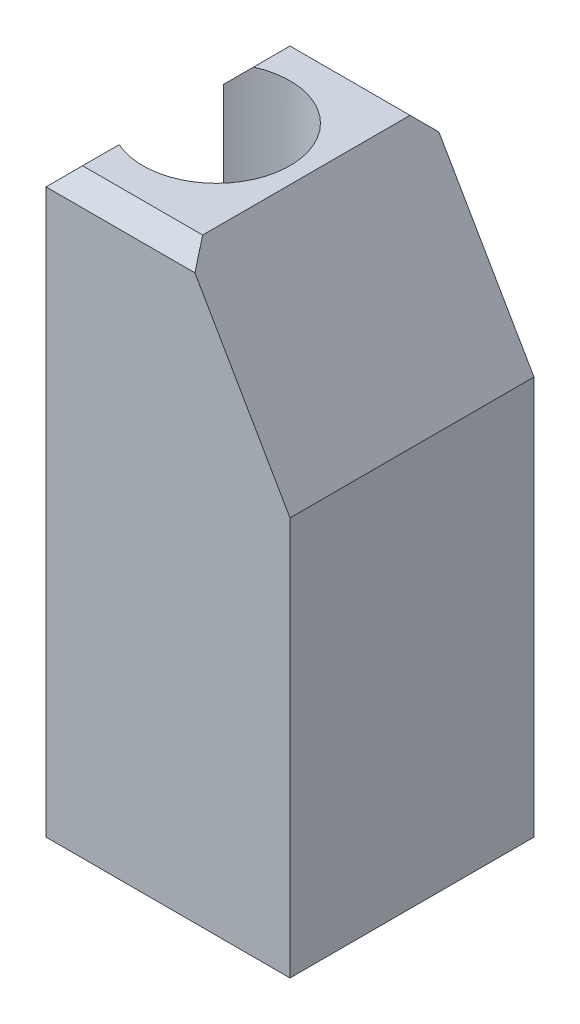
ISO-10303-21;
HEADER;
FILE_DESCRIPTION(('STEP AP214'),'2;1');
FILE_NAME('part.step','',(''),(''),'','','');
FILE_SCHEMA(('AUTOMOTIVE_DESIGN { 1 0 10303 214 1 1 1 1 }'));
ENDSEC;
DATA;
#1=APPLICATION_CONTEXT('core data for automotive mechanical design processes');
#2=APPLICATION_PROTOCOL_DEFINITION('international standard','automotive_design',2000,#1);
#3=PRODUCT_CONTEXT('',#1,'mechanical');
#4=PRODUCT('Part','Part','',(#3));
#5=PRODUCT_RELATED_PRODUCT_CATEGORY('part','',(#4));
#6=PRODUCT_DEFINITION_FORMATION('','',#4);
#7=PRODUCT_DEFINITION_CONTEXT('part definition',#1,'design');
#8=PRODUCT_DEFINITION('design','',#6,#7);
#9=PRODUCT_DEFINITION_SHAPE('','',#8);
#10=(LENGTH_UNIT() NAMED_UNIT(*) SI_UNIT(.MILLI.,.METRE.));
#11=(NAMED_UNIT(*) PLANE_ANGLE_UNIT() SI_UNIT($,.RADIAN.));
#12=(NAMED_UNIT(*) SI_UNIT($,.STERADIAN.) SOLID_ANGLE_UNIT());
#13=UNCERTAINTY_MEASURE_WITH_UNIT(LENGTH_MEASURE(1.E-05),#10,'distance_accuracy_value','');
#14=(GEOMETRIC_REPRESENTATION_CONTEXT(3) GLOBAL_UNCERTAINTY_ASSIGNED_CONTEXT((#13)) GLOBAL_UNIT_ASSIGNED_CONTEXT((#10,
#11,#12)) REPRESENTATION_CONTEXT('',''));
#15=CARTESIAN_POINT('',(0.,0.,0.));
#16=DIRECTION('',(0.,0.,1.));
#17=DIRECTION('',(1.,0.,0.));
#18=AXIS2_PLACEMENT_3D('',#15,#16,#17);
#19=CARTESIAN_POINT('',(20.,35.33,-20.));
#20=DIRECTION('',(-1.,0.,0.));
#21=DIRECTION('',(0.,0.,1.));
#22=AXIS2_PLACEMENT_3D('',#19,#20,#21);
#23=PLANE('',#22);
#24=DIRECTION('',(0.,-1.,0.));
#25=VECTOR('',#24,1.);
#26=CARTESIAN_POINT('',(20.,35.33,-20.));
#27=LINE('',#26,#25);
#28=CARTESIAN_POINT('',(20.,5.32999999999985,-20.));
#29=VERTEX_POINT('',#28);
#30=CARTESIAN_POINT('',(20.,-60.,-20.));
#31=VERTEX_POINT('',#30);
#32=EDGE_CURVE('E183',#29,#31,#27,.T.);
#33=ORIENTED_EDGE('',*,*,#32,.F.);
#34=DIRECTION('',(0.,0.,1.));
#35=VECTOR('',#34,1.);
#36=CARTESIAN_POINT('',(20.,5.32999999999985,20.));
#37=LINE('',#36,#35);
#38=CARTESIAN_POINT('',(20.,5.32999999999985,20.));
#39=VERTEX_POINT('',#38);
#40=EDGE_CURVE('E136',#29,#39,#37,.T.);
#41=ORIENTED_EDGE('',*,*,#40,.T.);
#42=DIRECTION('',(0.,-1.,0.));
#43=VECTOR('',#42,1.);
#44=CARTESIAN_POINT('',(20.,35.33,20.));
#45=LINE('',#44,#43);
#46=CARTESIAN_POINT('',(20.,-60.,20.));
#47=VERTEX_POINT('',#46);
#48=EDGE_CURVE('E130',#39,#47,#45,.T.);
#49=ORIENTED_EDGE('',*,*,#48,.T.);
#50=DIRECTION('',(0.,0.,1.));
#51=VECTOR('',#50,1.);
#52=CARTESIAN_POINT('',(20.,-60.,20.));
#53=LINE('',#52,#51);
#54=EDGE_CURVE('E134',#31,#47,#53,.T.);
#55=ORIENTED_EDGE('',*,*,#54,.F.);
#56=EDGE_LOOP('',(#33,#41,#49,#55));
#57=FACE_BOUND('',#56,.T.);
#58=ADVANCED_FACE('F47',(#57),#23,.F.);
#59=CARTESIAN_POINT('',(-20.,35.33,-20.));
#60=DIRECTION('',(0.,0.,1.));
#61=DIRECTION('',(1.,0.,0.));
#62=AXIS2_PLACEMENT_3D('',#59,#60,#61);
#63=PLANE('',#62);
#64=DIRECTION('',(0.,-1.,0.));
#65=VECTOR('',#64,1.);
#66=CARTESIAN_POINT('',(-20.,35.33,-20.));
#67=LINE('',#66,#65);
#68=CARTESIAN_POINT('',(-20.,32.33,-20.));
#69=VERTEX_POINT('',#68);
#70=CARTESIAN_POINT('',(-20.,-60.,-20.));
#71=VERTEX_POINT('',#70);
#72=EDGE_CURVE('E180',#69,#71,#67,.T.);
#73=ORIENTED_EDGE('',*,*,#72,.F.);
#74=DIRECTION('',(1.,0.,0.));
#75=VECTOR('',#74,1.);
#76=CARTESIAN_POINT('',(2.67949192431123,32.33,-20.));
#77=LINE('',#76,#75);
#78=CARTESIAN_POINT('',(4.41154273188011,32.33,-20.));
#79=VERTEX_POINT('',#78);
#80=EDGE_CURVE('E74',#69,#79,#77,.T.);
#81=ORIENTED_EDGE('',*,*,#80,.T.);
#82=DIRECTION('',(0.499999999999998,-0.86602540378444,0.));
#83=VECTOR('',#82,1.);
#84=CARTESIAN_POINT('',(2.67949192431123,35.33,-20.));
#85=LINE('',#84,#83);
#86=EDGE_CURVE('E194',#79,#29,#85,.T.);
#87=ORIENTED_EDGE('',*,*,#86,.T.);
#88=ORIENTED_EDGE('',*,*,#32,.T.);
#89=DIRECTION('',(1.,0.,0.));
#90=VECTOR('',#89,1.);
#91=CARTESIAN_POINT('',(20.,-60.,-20.));
#92=LINE('',#91,#90);
#93=EDGE_CURVE('E155',#71,#31,#92,.T.);
#94=ORIENTED_EDGE('',*,*,#93,.F.);
#95=EDGE_LOOP('',(#73,#81,#87,#88,#94));
#96=FACE_BOUND('',#95,.T.);
#97=ADVANCED_FACE('F259',(#96),#63,.F.);
#98=CARTESIAN_POINT('',(-20.,35.33,-20.));
#99=DIRECTION('',(1.,0.,0.));
#100=DIRECTION('',(0.,0.,-1.));
#101=AXIS2_PLACEMENT_3D('',#98,#99,#100);
#102=PLANE('',#101);
#103=DIRECTION('',(0.,1.,0.));
#104=VECTOR('',#103,1.);
#105=CARTESIAN_POINT('',(-20.,-6.67,-9.09945053286187));
#106=LINE('',#105,#104);
#107=CARTESIAN_POINT('',(-20.,0.,-9.09945053286187));
#108=VERTEX_POINT('',#107);
#109=CARTESIAN_POINT('',(-20.,32.33,-9.09945053286187));
#110=VERTEX_POINT('',#109);
#111=EDGE_CURVE('E140',#108,#110,#106,.T.);
#112=ORIENTED_EDGE('',*,*,#111,.T.);
#113=DIRECTION('',(0.,0.,-1.));
#114=VECTOR('',#113,1.);
#115=CARTESIAN_POINT('',(-20.,32.33,-20.));
#116=LINE('',#115,#114);
#117=EDGE_CURVE('E225',#110,#69,#116,.T.);
#118=ORIENTED_EDGE('',*,*,#117,.T.);
#119=ORIENTED_EDGE('',*,*,#72,.T.);
#120=DIRECTION('',(0.,0.,-1.));
#121=VECTOR('',#120,1.);
#122=CARTESIAN_POINT('',(-20.,-60.,20.));
#123=LINE('',#122,#121);
#124=CARTESIAN_POINT('',(-20.,-60.,20.));
#125=VERTEX_POINT('',#124);
#126=EDGE_CURVE('E150',#125,#71,#123,.T.);
#127=ORIENTED_EDGE('',*,*,#126,.F.);
#128=DIRECTION('',(0.,-1.,0.));
#129=VECTOR('',#128,1.);
#130=CARTESIAN_POINT('',(-20.,35.33,20.));
#131=LINE('',#130,#129);
#132=CARTESIAN_POINT('',(-20.,32.33,20.));
#133=VERTEX_POINT('',#132);
#134=EDGE_CURVE('E139',#133,#125,#131,.T.);
#135=ORIENTED_EDGE('',*,*,#134,.F.);
#136=DIRECTION('',(0.,0.,-1.));
#137=VECTOR('',#136,1.);
#138=CARTESIAN_POINT('',(-20.,32.33,9.09945053286187));
#139=LINE('',#138,#137);
#140=CARTESIAN_POINT('',(-20.,32.33,9.09945053286187));
#141=VERTEX_POINT('',#140);
#142=EDGE_CURVE('E222',#133,#141,#139,.T.);
#143=ORIENTED_EDGE('',*,*,#142,.T.);
#144=DIRECTION('',(0.,1.,0.));
#145=VECTOR('',#144,1.);
#146=CARTESIAN_POINT('',(-20.,-6.67,9.09945053286187));
#147=LINE('',#146,#145);
#148=CARTESIAN_POINT('',(-20.,0.,9.09945053286187));
#149=VERTEX_POINT('',#148);
#150=EDGE_CURVE('E172',#141,#149,#147,.F.);
#151=ORIENTED_EDGE('',*,*,#150,.T.);
#152=DIRECTION('',(0.,0.,-1.));
#153=VECTOR('',#152,1.);
#154=CARTESIAN_POINT('',(-20.,0.,20.));
#155=LINE('',#154,#153);
#156=EDGE_CURVE('E157',#149,#108,#155,.T.);
#157=ORIENTED_EDGE('',*,*,#156,.T.);
#158=EDGE_LOOP('',(#112,#118,#119,#127,#135,#143,#151,#157));
#159=FACE_BOUND('',#158,.T.);
#160=ADVANCED_FACE('F258',(#159),#102,.F.);
#161=CARTESIAN_POINT('',(-20.,35.33,20.));
#162=DIRECTION('',(0.,0.,-1.));
#163=DIRECTION('',(-1.,0.,0.));
#164=AXIS2_PLACEMENT_3D('',#161,#162,#163);
#165=PLANE('',#164);
#166=DIRECTION('',(-0.499999999999998,0.86602540378444,0.));
#167=VECTOR('',#166,1.);
#168=CARTESIAN_POINT('',(2.67949192431124,35.33,20.));
#169=LINE('',#168,#167);
#170=CARTESIAN_POINT('',(4.4115427318801,32.33,20.));
#171=VERTEX_POINT('',#170);
#172=EDGE_CURVE('E199',#39,#171,#169,.T.);
#173=ORIENTED_EDGE('',*,*,#172,.T.);
#174=DIRECTION('',(-1.,0.,0.));
#175=VECTOR('',#174,1.);
#176=CARTESIAN_POINT('',(-20.,32.33,20.));
#177=LINE('',#176,#175);
#178=EDGE_CURVE('E11',#171,#133,#177,.T.);
#179=ORIENTED_EDGE('',*,*,#178,.T.);
#180=ORIENTED_EDGE('',*,*,#134,.T.);
#181=DIRECTION('',(-1.,0.,0.));
#182=VECTOR('',#181,1.);
#183=CARTESIAN_POINT('',(20.,-60.,20.));
#184=LINE('',#183,#182);
#185=EDGE_CURVE('E143',#47,#125,#184,.T.);
#186=ORIENTED_EDGE('',*,*,#185,.F.);
#187=ORIENTED_EDGE('',*,*,#48,.F.);
#188=EDGE_LOOP('',(#173,#179,#180,#186,#187));
#189=FACE_BOUND('',#188,.T.);
#190=ADVANCED_FACE('F144',(#189),#165,.F.);
#191=CARTESIAN_POINT('',(0.,35.33,0.));
#192=DIRECTION('',(0.,1.,0.));
#193=DIRECTION('',(0.,0.,1.));
#194=AXIS2_PLACEMENT_3D('',#191,#192,#193);
#195=PLANE('',#194);
#196=DIRECTION('',(-1.,0.,0.));
#197=VECTOR('',#196,1.);
#198=CARTESIAN_POINT('',(-20.,35.33,-17.));
#199=LINE('',#198,#197);
#200=CARTESIAN_POINT('',(2.67949192431123,35.33,-17.));
#201=VERTEX_POINT('',#200);
#202=CARTESIAN_POINT('',(-17.,35.33,-17.));
#203=VERTEX_POINT('',#202);
#204=EDGE_CURVE('E209',#201,#203,#199,.T.);
#205=ORIENTED_EDGE('',*,*,#204,.T.);
#206=DIRECTION('',(0.,0.,1.));
#207=VECTOR('',#206,1.);
#208=CARTESIAN_POINT('',(-17.,35.33,-9.09945053286187));
#209=LINE('',#208,#207);
#210=CARTESIAN_POINT('',(-17.,35.33,-11.0172591872934));
#211=VERTEX_POINT('',#210);
#212=EDGE_CURVE('E212',#203,#211,#209,.T.);
#213=ORIENTED_EDGE('',*,*,#212,.T.);
#214=CARTESIAN_POINT('',(-12.07,35.33,0.));
#215=DIRECTION('',(0.,1.,0.));
#216=DIRECTION('',(0.,0.,1.));
#217=AXIS2_PLACEMENT_3D('',#214,#215,#216);
#218=CIRCLE('',#217,12.07);
#219=CARTESIAN_POINT('',(-17.,35.33,11.0172591872934));
#220=VERTEX_POINT('',#219);
#221=EDGE_CURVE('E167',#220,#211,#218,.T.);
#222=ORIENTED_EDGE('',*,*,#221,.F.);
#223=DIRECTION('',(0.,0.,1.));
#224=VECTOR('',#223,1.);
#225=CARTESIAN_POINT('',(-17.,35.33,20.));
#226=LINE('',#225,#224);
#227=CARTESIAN_POINT('',(-17.,35.33,17.));
#228=VERTEX_POINT('',#227);
#229=EDGE_CURVE('E205',#220,#228,#226,.T.);
#230=ORIENTED_EDGE('',*,*,#229,.T.);
#231=DIRECTION('',(1.,0.,0.));
#232=VECTOR('',#231,1.);
#233=CARTESIAN_POINT('',(2.67949192431124,35.33,17.));
#234=LINE('',#233,#232);
#235=CARTESIAN_POINT('',(2.67949192431124,35.33,17.));
#236=VERTEX_POINT('',#235);
#237=EDGE_CURVE('E202',#228,#236,#234,.T.);
#238=ORIENTED_EDGE('',*,*,#237,.T.);
#239=DIRECTION('',(0.,0.,-1.));
#240=VECTOR('',#239,1.);
#241=CARTESIAN_POINT('',(2.67949192431123,35.33,-20.));
#242=LINE('',#241,#240);
#243=EDGE_CURVE('E190',#236,#201,#242,.T.);
#244=ORIENTED_EDGE('',*,*,#243,.T.);
#245=EDGE_LOOP('',(#205,#213,#222,#230,#238,#244));
#246=FACE_BOUND('',#245,.T.);
#247=ADVANCED_FACE('F251',(#246),#195,.T.);
#248=CARTESIAN_POINT('',(-12.07,-6.67,0.));
#249=DIRECTION('',(0.,1.,0.));
#250=DIRECTION('',(0.,0.,1.));
#251=AXIS2_PLACEMENT_3D('',#248,#249,#250);
#252=CYLINDRICAL_SURFACE('',#251,12.07);
#253=ORIENTED_EDGE('',*,*,#221,.T.);
#254=CARTESIAN_POINT('',(-12.07,40.26,0.));
#255=DIRECTION('',(-0.707106781186549,0.707106781186546,0.));
#256=DIRECTION('',(0.707106781186546,0.707106781186549,0.));
#257=AXIS2_PLACEMENT_3D('',#254,#255,#256);
#258=ELLIPSE('',#257,17.0695576978433,12.07);
#259=EDGE_CURVE('E219',#211,#110,#258,.T.);
#260=ORIENTED_EDGE('',*,*,#259,.T.);
#261=ORIENTED_EDGE('',*,*,#111,.F.);
#262=CARTESIAN_POINT('',(-12.07,0.,0.));
#263=DIRECTION('',(0.,1.,0.));
#264=DIRECTION('',(0.,0.,1.));
#265=AXIS2_PLACEMENT_3D('',#262,#263,#264);
#266=CIRCLE('',#265,12.07);
#267=EDGE_CURVE('E186',#149,#108,#266,.T.);
#268=ORIENTED_EDGE('',*,*,#267,.F.);
#269=ORIENTED_EDGE('',*,*,#150,.F.);
#270=CARTESIAN_POINT('',(-12.07,40.26,0.));
#271=DIRECTION('',(-0.707106781186547,0.707106781186548,0.));
#272=DIRECTION('',(0.707106781186548,0.707106781186547,0.));
#273=AXIS2_PLACEMENT_3D('',#270,#271,#272);
#274=ELLIPSE('',#273,17.0695576978433,12.07);
#275=EDGE_CURVE('E216',#141,#220,#274,.T.);
#276=ORIENTED_EDGE('',*,*,#275,.T.);
#277=EDGE_LOOP('',(#253,#260,#261,#268,#269,#276));
#278=FACE_BOUND('',#277,.T.);
#279=ADVANCED_FACE('F253',(#278),#252,.F.);
#280=CARTESIAN_POINT('',(0.,0.,0.));
#281=DIRECTION('',(0.,1.,0.));
#282=DIRECTION('',(0.,0.,1.));
#283=AXIS2_PLACEMENT_3D('',#280,#281,#282);
#284=PLANE('',#283);
#285=ORIENTED_EDGE('',*,*,#156,.F.);
#286=ORIENTED_EDGE('',*,*,#267,.T.);
#287=EDGE_LOOP('',(#285,#286));
#288=FACE_BOUND('',#287,.T.);
#289=ADVANCED_FACE('F267',(#288),#284,.T.);
#290=CARTESIAN_POINT('',(0.,-60.,0.));
#291=DIRECTION('',(0.,1.,0.));
#292=DIRECTION('',(0.,0.,1.));
#293=AXIS2_PLACEMENT_3D('',#290,#291,#292);
#294=PLANE('',#293);
#295=ORIENTED_EDGE('',*,*,#54,.T.);
#296=ORIENTED_EDGE('',*,*,#185,.T.);
#297=ORIENTED_EDGE('',*,*,#126,.T.);
#298=ORIENTED_EDGE('',*,*,#93,.T.);
#299=EDGE_LOOP('',(#295,#296,#297,#298));
#300=FACE_BOUND('',#299,.T.);
#301=ADVANCED_FACE('F153',(#300),#294,.F.);
#302=CARTESIAN_POINT('',(2.67949192431124,35.33,0.));
#303=DIRECTION('',(0.86602540378444,0.499999999999998,0.));
#304=DIRECTION('',(0.,0.,1.));
#305=AXIS2_PLACEMENT_3D('',#302,#303,#304);
#306=PLANE('',#305);
#307=ORIENTED_EDGE('',*,*,#86,.F.);
#308=DIRECTION('',(-0.377964473009226,0.654653670707979,0.654653670707976));
#309=VECTOR('',#308,1.);
#310=CARTESIAN_POINT('',(-1.52691717978459,42.6157142857143,-9.71428571428574));
#311=LINE('',#310,#309);
#312=EDGE_CURVE('E58',#79,#201,#311,.T.);
#313=ORIENTED_EDGE('',*,*,#312,.T.);
#314=ORIENTED_EDGE('',*,*,#243,.F.);
#315=DIRECTION('',(0.377964473009226,-0.654653670707978,0.654653670707978));
#316=VECTOR('',#315,1.);
#317=CARTESIAN_POINT('',(-1.52691717978459,42.6157142857143,9.71428571428571));
#318=LINE('',#317,#316);
#319=EDGE_CURVE('E66',#236,#171,#318,.T.);
#320=ORIENTED_EDGE('',*,*,#319,.T.);
#321=ORIENTED_EDGE('',*,*,#172,.F.);
#322=ORIENTED_EDGE('',*,*,#40,.F.);
#323=EDGE_LOOP('',(#307,#313,#314,#320,#321,#322));
#324=FACE_BOUND('',#323,.T.);
#325=ADVANCED_FACE('F260',(#324),#306,.T.);
#326=CARTESIAN_POINT('',(0.,35.33,-17.));
#327=DIRECTION('',(0.,0.707106781186546,-0.707106781186549));
#328=DIRECTION('',(1.,0.,0.));
#329=AXIS2_PLACEMENT_3D('',#326,#327,#328);
#330=PLANE('',#329);
#331=ORIENTED_EDGE('',*,*,#312,.F.);
#332=ORIENTED_EDGE('',*,*,#80,.F.);
#333=DIRECTION('',(0.577350269189625,0.577350269189627,0.577350269189625));
#334=VECTOR('',#333,1.);
#335=CARTESIAN_POINT('',(-11.3333333333333,40.9966666666667,-11.3333333333334));
#336=LINE('',#335,#334);
#337=EDGE_CURVE('E161',#203,#69,#336,.F.);
#338=ORIENTED_EDGE('',*,*,#337,.F.);
#339=ORIENTED_EDGE('',*,*,#204,.F.);
#340=EDGE_LOOP('',(#331,#332,#338,#339));
#341=FACE_BOUND('',#340,.T.);
#342=ADVANCED_FACE('F264',(#341),#330,.T.);
#343=CARTESIAN_POINT('',(-17.,35.33,0.));
#344=DIRECTION('',(-0.707106781186549,0.707106781186546,0.));
#345=DIRECTION('',(0.,0.,-1.));
#346=AXIS2_PLACEMENT_3D('',#343,#344,#345);
#347=PLANE('',#346);
#348=ORIENTED_EDGE('',*,*,#337,.T.);
#349=ORIENTED_EDGE('',*,*,#117,.F.);
#350=ORIENTED_EDGE('',*,*,#259,.F.);
#351=ORIENTED_EDGE('',*,*,#212,.F.);
#352=EDGE_LOOP('',(#348,#349,#350,#351));
#353=FACE_BOUND('',#352,.T.);
#354=ADVANCED_FACE('F265',(#353),#347,.T.);
#355=CARTESIAN_POINT('',(0.,35.33,17.));
#356=DIRECTION('',(0.,0.707106781186548,0.707106781186548));
#357=DIRECTION('',(-1.,0.,0.));
#358=AXIS2_PLACEMENT_3D('',#355,#356,#357);
#359=PLANE('',#358);
#360=ORIENTED_EDGE('',*,*,#319,.F.);
#361=ORIENTED_EDGE('',*,*,#237,.F.);
#362=DIRECTION('',(-0.577350269189626,-0.577350269189626,0.577350269189626));
#363=VECTOR('',#362,1.);
#364=CARTESIAN_POINT('',(-11.3333333333333,40.9966666666667,11.3333333333333));
#365=LINE('',#364,#363);
#366=EDGE_CURVE('E52',#133,#228,#365,.F.);
#367=ORIENTED_EDGE('',*,*,#366,.F.);
#368=ORIENTED_EDGE('',*,*,#178,.F.);
#369=EDGE_LOOP('',(#360,#361,#367,#368));
#370=FACE_BOUND('',#369,.T.);
#371=ADVANCED_FACE('F50',(#370),#359,.T.);
#372=CARTESIAN_POINT('',(-17.,35.33,0.));
#373=DIRECTION('',(-0.707106781186547,0.707106781186548,0.));
#374=DIRECTION('',(0.,0.,-1.));
#375=AXIS2_PLACEMENT_3D('',#372,#373,#374);
#376=PLANE('',#375);
#377=ORIENTED_EDGE('',*,*,#275,.F.);
#378=ORIENTED_EDGE('',*,*,#142,.F.);
#379=ORIENTED_EDGE('',*,*,#366,.T.);
#380=ORIENTED_EDGE('',*,*,#229,.F.);
#381=EDGE_LOOP('',(#377,#378,#379,#380));
#382=FACE_BOUND('',#381,.T.);
#383=ADVANCED_FACE('F246',(#382),#376,.T.);
#384=CLOSED_SHELL('',(#58,#97,#160,#190,#247,#279,#289,#301,#325,#342,#354,#371,#383));
#385=MANIFOLD_SOLID_BREP('B2',#384);
#386=ADVANCED_BREP_SHAPE_REPRESENTATION('',(#18,#385),#14);
#387=SHAPE_DEFINITION_REPRESENTATION(#9,#386);
ENDSEC;
END-ISO-10303-21;
